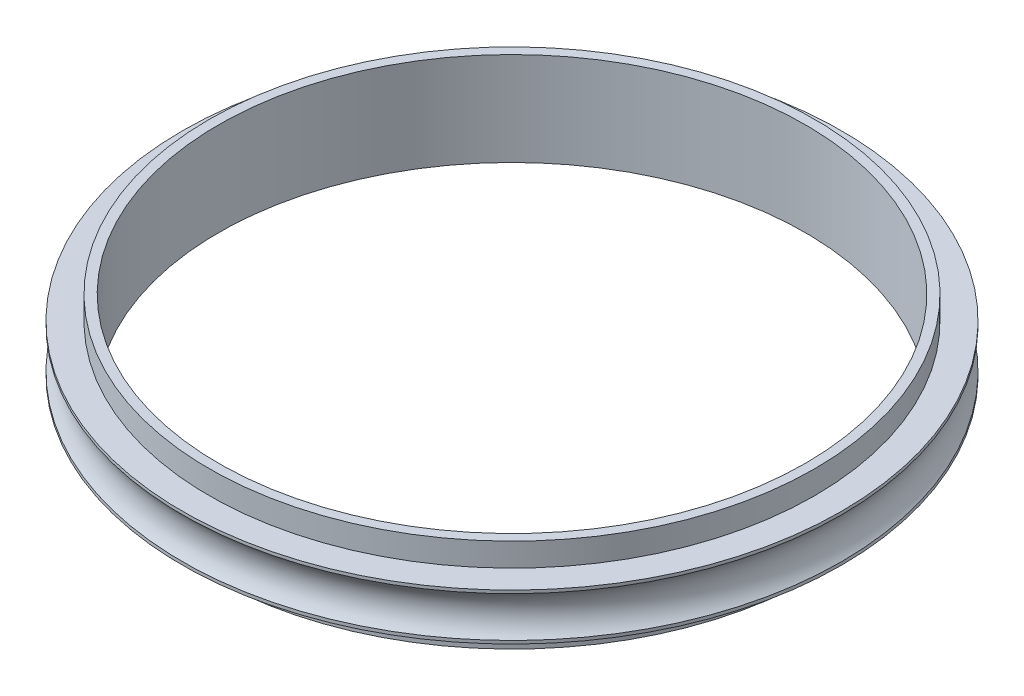
ISO-10303-21;
HEADER;
FILE_DESCRIPTION(('STEP AP214'),'2;1');
FILE_NAME('part.step','',(''),(''),'','','');
FILE_SCHEMA(('AUTOMOTIVE_DESIGN { 1 0 10303 214 1 1 1 1 }'));
ENDSEC;
DATA;
#1=APPLICATION_CONTEXT('core data for automotive mechanical design processes');
#2=APPLICATION_PROTOCOL_DEFINITION('international standard','automotive_design',2000,#1);
#3=PRODUCT_CONTEXT('',#1,'mechanical');
#4=PRODUCT('Part','Part','',(#3));
#5=PRODUCT_RELATED_PRODUCT_CATEGORY('part','',(#4));
#6=PRODUCT_DEFINITION_FORMATION('','',#4);
#7=PRODUCT_DEFINITION_CONTEXT('part definition',#1,'design');
#8=PRODUCT_DEFINITION('design','',#6,#7);
#9=PRODUCT_DEFINITION_SHAPE('','',#8);
#10=(LENGTH_UNIT() NAMED_UNIT(*) SI_UNIT(.MILLI.,.METRE.));
#11=(NAMED_UNIT(*) PLANE_ANGLE_UNIT() SI_UNIT($,.RADIAN.));
#12=(NAMED_UNIT(*) SI_UNIT($,.STERADIAN.) SOLID_ANGLE_UNIT());
#13=UNCERTAINTY_MEASURE_WITH_UNIT(LENGTH_MEASURE(1.E-05),#10,'distance_accuracy_value','');
#14=(GEOMETRIC_REPRESENTATION_CONTEXT(3) GLOBAL_UNCERTAINTY_ASSIGNED_CONTEXT((#13)) GLOBAL_UNIT_ASSIGNED_CONTEXT((#10,
#11,#12)) REPRESENTATION_CONTEXT('',''));
#15=CARTESIAN_POINT('',(0.,0.,0.));
#16=DIRECTION('',(0.,0.,1.));
#17=DIRECTION('',(1.,0.,0.));
#18=AXIS2_PLACEMENT_3D('',#15,#16,#17);
#19=CARTESIAN_POINT('',(30.,4.4,0.));
#20=DIRECTION('',(0.,-1.,0.));
#21=DIRECTION('',(-1.,0.,0.));
#22=AXIS2_PLACEMENT_3D('',#19,#20,#21);
#23=CYLINDRICAL_SURFACE('',#22,25.9);
#24=CARTESIAN_POINT('',(30.,2.,0.));
#25=DIRECTION('',(0.,-1.,0.));
#26=DIRECTION('',(-1.,0.,0.));
#27=AXIS2_PLACEMENT_3D('',#24,#25,#26);
#28=CIRCLE('',#27,25.9);
#29=CARTESIAN_POINT('',(55.9,2.,0.));
#30=VERTEX_POINT('',#29);
#31=EDGE_CURVE('E27',#30,#30,#28,.T.);
#32=ORIENTED_EDGE('',*,*,#31,.F.);
#33=DIRECTION('',(0.,1.,0.));
#34=VECTOR('',#33,1.);
#35=CARTESIAN_POINT('',(55.9,4.4,0.));
#36=LINE('',#35,#34);
#37=CARTESIAN_POINT('',(55.9,4.,0.));
#38=VERTEX_POINT('',#37);
#39=EDGE_CURVE('E11',#30,#38,#36,.T.);
#40=ORIENTED_EDGE('',*,*,#39,.T.);
#41=CARTESIAN_POINT('',(30.,4.,0.));
#42=DIRECTION('',(0.,1.,0.));
#43=DIRECTION('',(-1.,0.,0.));
#44=AXIS2_PLACEMENT_3D('',#41,#42,#43);
#45=CIRCLE('',#44,25.9);
#46=EDGE_CURVE('E134',#38,#38,#45,.T.);
#47=ORIENTED_EDGE('',*,*,#46,.F.);
#48=ORIENTED_EDGE('',*,*,#39,.F.);
#49=EDGE_LOOP('',(#32,#40,#47,#48));
#50=FACE_BOUND('',#49,.T.);
#51=ADVANCED_FACE('F17',(#50),#23,.T.);
#52=CARTESIAN_POINT('',(30.,2.,0.));
#53=DIRECTION('',(0.,-1.,0.));
#54=DIRECTION('',(0.,0.,-1.));
#55=AXIS2_PLACEMENT_3D('',#52,#53,#54);
#56=PLANE('',#55);
#57=ORIENTED_EDGE('',*,*,#31,.T.);
#58=EDGE_LOOP('',(#57));
#59=FACE_BOUND('',#58,.T.);
#60=CARTESIAN_POINT('',(30.,2.,0.));
#61=DIRECTION('',(0.,-1.,0.));
#62=DIRECTION('',(-1.,0.,0.));
#63=AXIS2_PLACEMENT_3D('',#60,#61,#62);
#64=CIRCLE('',#63,28.2);
#65=CARTESIAN_POINT('',(58.2,2.,0.));
#66=VERTEX_POINT('',#65);
#67=EDGE_CURVE('E117',#66,#66,#64,.T.);
#68=ORIENTED_EDGE('',*,*,#67,.F.);
#69=EDGE_LOOP('',(#68));
#70=FACE_BOUND('',#69,.T.);
#71=ADVANCED_FACE('F144',(#59,#70),#56,.F.);
#72=CARTESIAN_POINT('',(30.,4.4,0.));
#73=DIRECTION('',(0.,-1.,0.));
#74=DIRECTION('',(-1.,0.,0.));
#75=AXIS2_PLACEMENT_3D('',#72,#73,#74);
#76=CYLINDRICAL_SURFACE('',#75,28.2);
#77=CARTESIAN_POINT('',(30.,1.73493515729,0.));
#78=DIRECTION('',(0.,-1.,0.));
#79=DIRECTION('',(-1.,0.,0.));
#80=AXIS2_PLACEMENT_3D('',#77,#78,#79);
#81=CIRCLE('',#80,28.2);
#82=CARTESIAN_POINT('',(58.2,1.73493515729,0.));
#83=VERTEX_POINT('',#82);
#84=EDGE_CURVE('E20',#83,#83,#81,.T.);
#85=ORIENTED_EDGE('',*,*,#84,.F.);
#86=DIRECTION('',(0.,1.,0.));
#87=VECTOR('',#86,1.);
#88=CARTESIAN_POINT('',(58.2,4.4,0.));
#89=LINE('',#88,#87);
#90=EDGE_CURVE('E114',#83,#66,#89,.T.);
#91=ORIENTED_EDGE('',*,*,#90,.T.);
#92=ORIENTED_EDGE('',*,*,#67,.T.);
#93=ORIENTED_EDGE('',*,*,#90,.F.);
#94=EDGE_LOOP('',(#85,#91,#92,#93));
#95=FACE_BOUND('',#94,.T.);
#96=ADVANCED_FACE('F149',(#95),#76,.T.);
#97=CARTESIAN_POINT('',(30.,0.,0.));
#98=DIRECTION('',(0.,-1.,0.));
#99=DIRECTION('',(-1.,0.,0.));
#100=AXIS2_PLACEMENT_3D('',#97,#98,#99);
#101=TOROIDAL_SURFACE('',#100,30.,2.5);
#102=CARTESIAN_POINT('',(30.,-1.73493515729,0.));
#103=DIRECTION('',(0.,-1.,0.));
#104=DIRECTION('',(-1.,0.,0.));
#105=AXIS2_PLACEMENT_3D('',#102,#103,#104);
#106=CIRCLE('',#105,28.2);
#107=CARTESIAN_POINT('',(58.2,-1.73493515729,0.));
#108=VERTEX_POINT('',#107);
#109=EDGE_CURVE('E109',#108,#108,#106,.T.);
#110=ORIENTED_EDGE('',*,*,#109,.F.);
#111=CARTESIAN_POINT('',(60.,0.,0.));
#112=DIRECTION('',(0.,0.,-1.));
#113=DIRECTION('',(1.,0.,0.));
#114=AXIS2_PLACEMENT_3D('',#111,#112,#113);
#115=CIRCLE('',#114,2.5);
#116=EDGE_CURVE('E113',#108,#83,#115,.T.);
#117=ORIENTED_EDGE('',*,*,#116,.T.);
#118=ORIENTED_EDGE('',*,*,#84,.T.);
#119=ORIENTED_EDGE('',*,*,#116,.F.);
#120=EDGE_LOOP('',(#110,#117,#118,#119));
#121=FACE_BOUND('',#120,.T.);
#122=ADVANCED_FACE('F154',(#121),#101,.F.);
#123=CARTESIAN_POINT('',(30.,4.4,0.));
#124=DIRECTION('',(0.,-1.,0.));
#125=DIRECTION('',(-1.,0.,0.));
#126=AXIS2_PLACEMENT_3D('',#123,#124,#125);
#127=CYLINDRICAL_SURFACE('',#126,28.2);
#128=CARTESIAN_POINT('',(30.,-2.,0.));
#129=DIRECTION('',(0.,-1.,0.));
#130=DIRECTION('',(-1.,0.,0.));
#131=AXIS2_PLACEMENT_3D('',#128,#129,#130);
#132=CIRCLE('',#131,28.2);
#133=CARTESIAN_POINT('',(58.2,-2.,0.));
#134=VERTEX_POINT('',#133);
#135=EDGE_CURVE('E94',#134,#134,#132,.T.);
#136=ORIENTED_EDGE('',*,*,#135,.F.);
#137=DIRECTION('',(0.,1.,0.));
#138=VECTOR('',#137,1.);
#139=CARTESIAN_POINT('',(58.2,4.4,0.));
#140=LINE('',#139,#138);
#141=EDGE_CURVE('E102',#134,#108,#140,.T.);
#142=ORIENTED_EDGE('',*,*,#141,.T.);
#143=ORIENTED_EDGE('',*,*,#109,.T.);
#144=ORIENTED_EDGE('',*,*,#141,.F.);
#145=EDGE_LOOP('',(#136,#142,#143,#144));
#146=FACE_BOUND('',#145,.T.);
#147=ADVANCED_FACE('F164',(#146),#127,.T.);
#148=CARTESIAN_POINT('',(30.,-2.,0.));
#149=DIRECTION('',(0.,-1.,0.));
#150=DIRECTION('',(0.,0.,-1.));
#151=AXIS2_PLACEMENT_3D('',#148,#149,#150);
#152=PLANE('',#151);
#153=CARTESIAN_POINT('',(30.,-2.,0.));
#154=DIRECTION('',(0.,-1.,0.));
#155=DIRECTION('',(-1.,0.,0.));
#156=AXIS2_PLACEMENT_3D('',#153,#154,#155);
#157=CIRCLE('',#156,25.9);
#158=CARTESIAN_POINT('',(55.9,-2.,0.));
#159=VERTEX_POINT('',#158);
#160=EDGE_CURVE('E87',#159,#159,#157,.T.);
#161=ORIENTED_EDGE('',*,*,#160,.F.);
#162=EDGE_LOOP('',(#161));
#163=FACE_BOUND('',#162,.T.);
#164=ORIENTED_EDGE('',*,*,#135,.T.);
#165=EDGE_LOOP('',(#164));
#166=FACE_BOUND('',#165,.T.);
#167=ADVANCED_FACE('F167',(#163,#166),#152,.T.);
#168=CARTESIAN_POINT('',(30.,4.4,0.));
#169=DIRECTION('',(0.,-1.,0.));
#170=DIRECTION('',(-1.,0.,0.));
#171=AXIS2_PLACEMENT_3D('',#168,#169,#170);
#172=CYLINDRICAL_SURFACE('',#171,25.9);
#173=CARTESIAN_POINT('',(30.,-4.,0.));
#174=DIRECTION('',(0.,-1.,0.));
#175=DIRECTION('',(-1.,0.,0.));
#176=AXIS2_PLACEMENT_3D('',#173,#174,#175);
#177=CIRCLE('',#176,25.9);
#178=CARTESIAN_POINT('',(55.9,-4.,0.));
#179=VERTEX_POINT('',#178);
#180=EDGE_CURVE('E104',#179,#179,#177,.T.);
#181=ORIENTED_EDGE('',*,*,#180,.F.);
#182=DIRECTION('',(0.,1.,0.));
#183=VECTOR('',#182,1.);
#184=CARTESIAN_POINT('',(55.9,4.4,0.));
#185=LINE('',#184,#183);
#186=EDGE_CURVE('E90',#179,#159,#185,.T.);
#187=ORIENTED_EDGE('',*,*,#186,.T.);
#188=ORIENTED_EDGE('',*,*,#160,.T.);
#189=ORIENTED_EDGE('',*,*,#186,.F.);
#190=EDGE_LOOP('',(#181,#187,#188,#189));
#191=FACE_BOUND('',#190,.T.);
#192=ADVANCED_FACE('F89',(#191),#172,.T.);
#193=CARTESIAN_POINT('',(30.,-4.,0.));
#194=DIRECTION('',(0.,-1.,0.));
#195=DIRECTION('',(0.,0.,-1.));
#196=AXIS2_PLACEMENT_3D('',#193,#194,#195);
#197=PLANE('',#196);
#198=CARTESIAN_POINT('',(30.,-4.,0.));
#199=DIRECTION('',(0.,-1.,0.));
#200=DIRECTION('',(-1.,0.,0.));
#201=AXIS2_PLACEMENT_3D('',#198,#199,#200);
#202=CIRCLE('',#201,25.1);
#203=CARTESIAN_POINT('',(55.1,-4.,0.));
#204=VERTEX_POINT('',#203);
#205=EDGE_CURVE('E78',#204,#204,#202,.T.);
#206=ORIENTED_EDGE('',*,*,#205,.F.);
#207=EDGE_LOOP('',(#206));
#208=FACE_BOUND('',#207,.T.);
#209=ORIENTED_EDGE('',*,*,#180,.T.);
#210=EDGE_LOOP('',(#209));
#211=FACE_BOUND('',#210,.T.);
#212=ADVANCED_FACE('F159',(#208,#211),#197,.T.);
#213=CARTESIAN_POINT('',(30.,4.4,0.));
#214=DIRECTION('',(0.,-1.,0.));
#215=DIRECTION('',(-1.,0.,0.));
#216=AXIS2_PLACEMENT_3D('',#213,#214,#215);
#217=CYLINDRICAL_SURFACE('',#216,25.1);
#218=CARTESIAN_POINT('',(30.,4.,0.));
#219=DIRECTION('',(0.,-1.,0.));
#220=DIRECTION('',(-1.,0.,0.));
#221=AXIS2_PLACEMENT_3D('',#218,#219,#220);
#222=CIRCLE('',#221,25.1);
#223=CARTESIAN_POINT('',(55.1,4.,0.));
#224=VERTEX_POINT('',#223);
#225=EDGE_CURVE('E123',#224,#224,#222,.T.);
#226=ORIENTED_EDGE('',*,*,#225,.F.);
#227=DIRECTION('',(0.,-1.,0.));
#228=VECTOR('',#227,1.);
#229=CARTESIAN_POINT('',(55.1,4.4,0.));
#230=LINE('',#229,#228);
#231=EDGE_CURVE('E69',#224,#204,#230,.T.);
#232=ORIENTED_EDGE('',*,*,#231,.T.);
#233=ORIENTED_EDGE('',*,*,#205,.T.);
#234=ORIENTED_EDGE('',*,*,#231,.F.);
#235=EDGE_LOOP('',(#226,#232,#233,#234));
#236=FACE_BOUND('',#235,.T.);
#237=ADVANCED_FACE('F161',(#236),#217,.F.);
#238=CARTESIAN_POINT('',(30.,4.,0.));
#239=DIRECTION('',(0.,-1.,0.));
#240=DIRECTION('',(0.,0.,-1.));
#241=AXIS2_PLACEMENT_3D('',#238,#239,#240);
#242=PLANE('',#241);
#243=ORIENTED_EDGE('',*,*,#225,.T.);
#244=EDGE_LOOP('',(#243));
#245=FACE_BOUND('',#244,.T.);
#246=ORIENTED_EDGE('',*,*,#46,.T.);
#247=EDGE_LOOP('',(#246));
#248=FACE_BOUND('',#247,.T.);
#249=ADVANCED_FACE('F142',(#245,#248),#242,.F.);
#250=CLOSED_SHELL('',(#51,#71,#96,#122,#147,#167,#192,#212,#237,#249));
#251=MANIFOLD_SOLID_BREP('B1',#250);
#252=ADVANCED_BREP_SHAPE_REPRESENTATION('',(#18,#251),#14);
#253=SHAPE_DEFINITION_REPRESENTATION(#9,#252);
ENDSEC;
END-ISO-10303-21;
